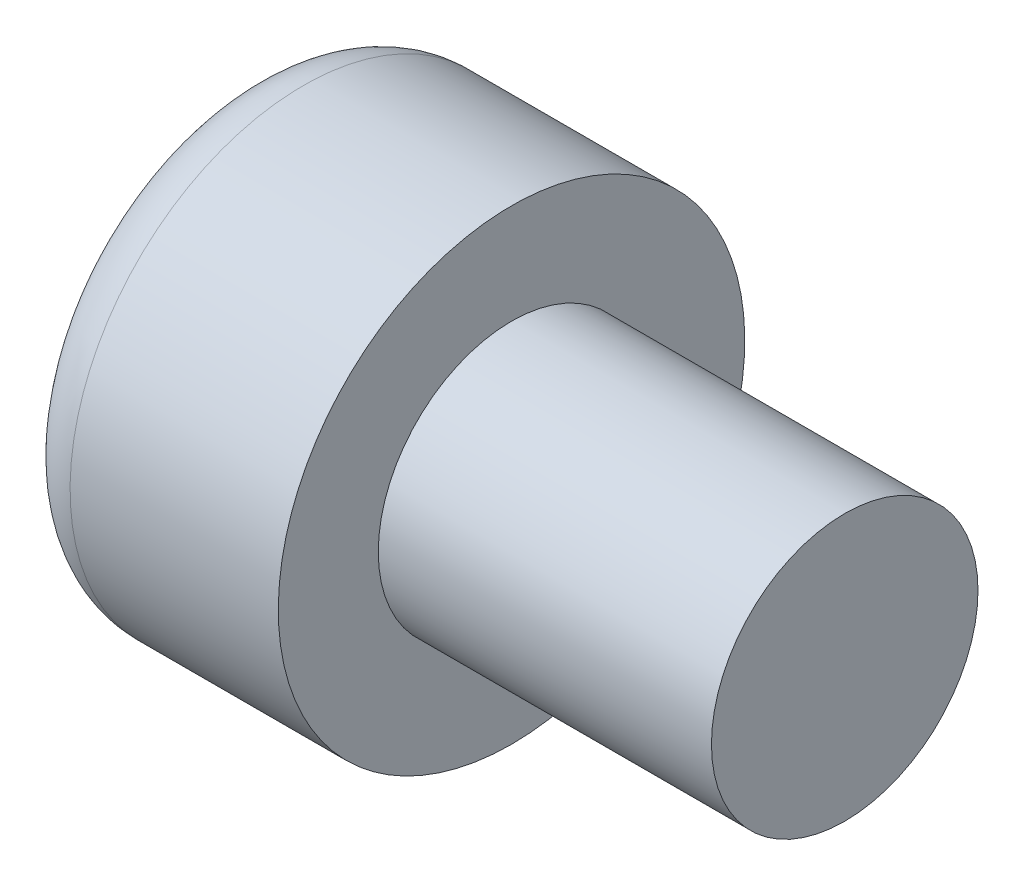
ISO-10303-21;
HEADER;
FILE_DESCRIPTION(('STEP AP214'),'2;1');
FILE_NAME('part.step','',(''),(''),'','','');
FILE_SCHEMA(('AUTOMOTIVE_DESIGN { 1 0 10303 214 1 1 1 1 }'));
ENDSEC;
DATA;
#1=APPLICATION_CONTEXT('core data for automotive mechanical design processes');
#2=APPLICATION_PROTOCOL_DEFINITION('international standard','automotive_design',2000,#1);
#3=PRODUCT_CONTEXT('',#1,'mechanical');
#4=PRODUCT('Part','Part','',(#3));
#5=PRODUCT_RELATED_PRODUCT_CATEGORY('part','',(#4));
#6=PRODUCT_DEFINITION_FORMATION('','',#4);
#7=PRODUCT_DEFINITION_CONTEXT('part definition',#1,'design');
#8=PRODUCT_DEFINITION('design','',#6,#7);
#9=PRODUCT_DEFINITION_SHAPE('','',#8);
#10=(LENGTH_UNIT() NAMED_UNIT(*) SI_UNIT(.MILLI.,.METRE.));
#11=(NAMED_UNIT(*) PLANE_ANGLE_UNIT() SI_UNIT($,.RADIAN.));
#12=(NAMED_UNIT(*) SI_UNIT($,.STERADIAN.) SOLID_ANGLE_UNIT());
#13=UNCERTAINTY_MEASURE_WITH_UNIT(LENGTH_MEASURE(1.E-05),#10,'distance_accuracy_value','');
#14=(GEOMETRIC_REPRESENTATION_CONTEXT(3) GLOBAL_UNCERTAINTY_ASSIGNED_CONTEXT((#13)) GLOBAL_UNIT_ASSIGNED_CONTEXT((#10,
#11,#12)) REPRESENTATION_CONTEXT('',''));
#15=CARTESIAN_POINT('',(0.,0.,0.));
#16=DIRECTION('',(0.,0.,1.));
#17=DIRECTION('',(1.,0.,0.));
#18=AXIS2_PLACEMENT_3D('',#15,#16,#17);
#19=CARTESIAN_POINT('',(0.,0.,0.));
#20=DIRECTION('',(1.,0.,0.));
#21=DIRECTION('',(0.,1.,0.));
#22=AXIS2_PLACEMENT_3D('',#19,#20,#21);
#23=PLANE('',#22);
#24=DIRECTION('',(0.,-0.5,-0.866025403784439));
#25=VECTOR('',#24,1.);
#26=CARTESIAN_POINT('',(0.,1.73205080756888,0.));
#27=LINE('',#26,#25);
#28=CARTESIAN_POINT('',(0.,1.73205080756888,0.));
#29=VERTEX_POINT('',#28);
#30=CARTESIAN_POINT('',(0.,0.866025403784439,-1.5));
#31=VERTEX_POINT('',#30);
#32=EDGE_CURVE('E120',#29,#31,#27,.T.);
#33=ORIENTED_EDGE('',*,*,#32,.F.);
#34=DIRECTION('',(0.,0.5,-0.866025403784439));
#35=VECTOR('',#34,1.);
#36=CARTESIAN_POINT('',(0.,0.866025403784439,1.5));
#37=LINE('',#36,#35);
#38=CARTESIAN_POINT('',(0.,0.866025403784439,1.5));
#39=VERTEX_POINT('',#38);
#40=EDGE_CURVE('E46',#39,#29,#37,.T.);
#41=ORIENTED_EDGE('',*,*,#40,.F.);
#42=DIRECTION('',(0.,1.,0.));
#43=VECTOR('',#42,1.);
#44=CARTESIAN_POINT('',(0.,-0.866025403784439,1.5));
#45=LINE('',#44,#43);
#46=CARTESIAN_POINT('',(0.,-0.866025403784439,1.5));
#47=VERTEX_POINT('',#46);
#48=EDGE_CURVE('E129',#47,#39,#45,.T.);
#49=ORIENTED_EDGE('',*,*,#48,.F.);
#50=DIRECTION('',(0.,0.5,0.866025403784439));
#51=VECTOR('',#50,1.);
#52=CARTESIAN_POINT('',(0.,-1.73205080756888,0.));
#53=LINE('',#52,#51);
#54=CARTESIAN_POINT('',(0.,-1.73205080756888,0.));
#55=VERTEX_POINT('',#54);
#56=EDGE_CURVE('E127',#55,#47,#53,.T.);
#57=ORIENTED_EDGE('',*,*,#56,.F.);
#58=DIRECTION('',(0.,-0.5,0.866025403784439));
#59=VECTOR('',#58,1.);
#60=CARTESIAN_POINT('',(0.,-0.866025403784439,-1.5));
#61=LINE('',#60,#59);
#62=CARTESIAN_POINT('',(0.,-0.866025403784439,-1.5));
#63=VERTEX_POINT('',#62);
#64=EDGE_CURVE('E94',#63,#55,#61,.T.);
#65=ORIENTED_EDGE('',*,*,#64,.F.);
#66=DIRECTION('',(0.,-1.,0.));
#67=VECTOR('',#66,1.);
#68=CARTESIAN_POINT('',(0.,0.866025403784439,-1.5));
#69=LINE('',#68,#67);
#70=EDGE_CURVE('E123',#31,#63,#69,.T.);
#71=ORIENTED_EDGE('',*,*,#70,.F.);
#72=EDGE_LOOP('',(#33,#41,#49,#57,#65,#71));
#73=FACE_BOUND('',#72,.T.);
#74=CARTESIAN_POINT('',(0.,0.,0.));
#75=DIRECTION('',(-1.,0.,0.));
#76=DIRECTION('',(0.,-1.,0.));
#77=AXIS2_PLACEMENT_3D('',#74,#75,#76);
#78=CIRCLE('',#77,2.625);
#79=CARTESIAN_POINT('',(0.,-2.625,0.));
#80=VERTEX_POINT('',#79);
#81=EDGE_CURVE('E11',#80,#80,#78,.T.);
#82=ORIENTED_EDGE('',*,*,#81,.T.);
#83=EDGE_LOOP('',(#82));
#84=FACE_BOUND('',#83,.T.);
#85=ADVANCED_FACE('F32',(#73,#84),#23,.F.);
#86=CARTESIAN_POINT('',(0.874999999999999,0.,0.));
#87=DIRECTION('',(-1.,0.,0.));
#88=DIRECTION('',(0.,-1.,0.));
#89=AXIS2_PLACEMENT_3D('',#86,#87,#88);
#90=TOROIDAL_SURFACE('',#89,2.625,0.875);
#91=ORIENTED_EDGE('',*,*,#81,.F.);
#92=EDGE_LOOP('',(#91));
#93=FACE_BOUND('',#92,.T.);
#94=CARTESIAN_POINT('',(0.874999999999999,0.,0.));
#95=DIRECTION('',(-1.,0.,0.));
#96=DIRECTION('',(0.,-1.,0.));
#97=AXIS2_PLACEMENT_3D('',#94,#95,#96);
#98=CIRCLE('',#97,3.5);
#99=CARTESIAN_POINT('',(0.874999999999998,-3.5,0.));
#100=VERTEX_POINT('',#99);
#101=EDGE_CURVE('E39',#100,#100,#98,.T.);
#102=ORIENTED_EDGE('',*,*,#101,.T.);
#103=EDGE_LOOP('',(#102));
#104=FACE_BOUND('',#103,.T.);
#105=ADVANCED_FACE('F149',(#93,#104),#90,.T.);
#106=CARTESIAN_POINT('',(0.,0.,0.));
#107=DIRECTION('',(-1.,0.,0.));
#108=DIRECTION('',(0.,-1.,0.));
#109=AXIS2_PLACEMENT_3D('',#106,#107,#108);
#110=CYLINDRICAL_SURFACE('',#109,3.5);
#111=ORIENTED_EDGE('',*,*,#101,.F.);
#112=EDGE_LOOP('',(#111));
#113=FACE_BOUND('',#112,.T.);
#114=CARTESIAN_POINT('',(4.,0.,0.));
#115=DIRECTION('',(-1.,0.,0.));
#116=DIRECTION('',(0.,-1.,0.));
#117=AXIS2_PLACEMENT_3D('',#114,#115,#116);
#118=CIRCLE('',#117,3.5);
#119=CARTESIAN_POINT('',(4.,-3.5,0.));
#120=VERTEX_POINT('',#119);
#121=EDGE_CURVE('E144',#120,#120,#118,.T.);
#122=ORIENTED_EDGE('',*,*,#121,.T.);
#123=EDGE_LOOP('',(#122));
#124=FACE_BOUND('',#123,.T.);
#125=ADVANCED_FACE('F151',(#113,#124),#110,.T.);
#126=CARTESIAN_POINT('',(4.,3.5,0.));
#127=DIRECTION('',(-1.,0.,0.));
#128=DIRECTION('',(0.,-1.,0.));
#129=AXIS2_PLACEMENT_3D('',#126,#127,#128);
#130=PLANE('',#129);
#131=ORIENTED_EDGE('',*,*,#121,.F.);
#132=EDGE_LOOP('',(#131));
#133=FACE_BOUND('',#132,.T.);
#134=CARTESIAN_POINT('',(4.,0.,0.));
#135=DIRECTION('',(-1.,0.,0.));
#136=DIRECTION('',(0.,-1.,0.));
#137=AXIS2_PLACEMENT_3D('',#134,#135,#136);
#138=CIRCLE('',#137,2.);
#139=CARTESIAN_POINT('',(4.,-2.,0.));
#140=VERTEX_POINT('',#139);
#141=EDGE_CURVE('E141',#140,#140,#138,.T.);
#142=ORIENTED_EDGE('',*,*,#141,.T.);
#143=EDGE_LOOP('',(#142));
#144=FACE_BOUND('',#143,.T.);
#145=ADVANCED_FACE('F154',(#133,#144),#130,.F.);
#146=CARTESIAN_POINT('',(0.,0.,0.));
#147=DIRECTION('',(-1.,0.,0.));
#148=DIRECTION('',(0.,-1.,0.));
#149=AXIS2_PLACEMENT_3D('',#146,#147,#148);
#150=CYLINDRICAL_SURFACE('',#149,2.);
#151=ORIENTED_EDGE('',*,*,#141,.F.);
#152=EDGE_LOOP('',(#151));
#153=FACE_BOUND('',#152,.T.);
#154=CARTESIAN_POINT('',(9.,0.,0.));
#155=DIRECTION('',(-1.,0.,0.));
#156=DIRECTION('',(0.,-1.,0.));
#157=AXIS2_PLACEMENT_3D('',#154,#155,#156);
#158=CIRCLE('',#157,2.);
#159=CARTESIAN_POINT('',(9.,-2.,0.));
#160=VERTEX_POINT('',#159);
#161=EDGE_CURVE('E133',#160,#160,#158,.T.);
#162=ORIENTED_EDGE('',*,*,#161,.T.);
#163=EDGE_LOOP('',(#162));
#164=FACE_BOUND('',#163,.T.);
#165=ADVANCED_FACE('F160',(#153,#164),#150,.T.);
#166=CARTESIAN_POINT('',(9.,2.,0.));
#167=DIRECTION('',(-1.,0.,0.));
#168=DIRECTION('',(0.,-1.,0.));
#169=AXIS2_PLACEMENT_3D('',#166,#167,#168);
#170=PLANE('',#169);
#171=ORIENTED_EDGE('',*,*,#161,.F.);
#172=EDGE_LOOP('',(#171));
#173=FACE_BOUND('',#172,.T.);
#174=ADVANCED_FACE('F166',(#173),#170,.F.);
#175=CARTESIAN_POINT('',(2.,0.866025403784439,1.5));
#176=DIRECTION('',(0.,0.866025403784439,0.5));
#177=DIRECTION('',(0.,-0.5,0.866025403784439));
#178=AXIS2_PLACEMENT_3D('',#175,#176,#177);
#179=PLANE('',#178);
#180=ORIENTED_EDGE('',*,*,#40,.T.);
#181=DIRECTION('',(-1.,0.,0.));
#182=VECTOR('',#181,1.);
#183=CARTESIAN_POINT('',(2.,1.73205080756888,0.));
#184=LINE('',#183,#182);
#185=CARTESIAN_POINT('',(2.,1.73205080756888,0.));
#186=VERTEX_POINT('',#185);
#187=EDGE_CURVE('E76',#186,#29,#184,.T.);
#188=ORIENTED_EDGE('',*,*,#187,.F.);
#189=DIRECTION('',(0.,0.5,-0.866025403784439));
#190=VECTOR('',#189,1.);
#191=CARTESIAN_POINT('',(2.,0.866025403784439,1.5));
#192=LINE('',#191,#190);
#193=CARTESIAN_POINT('',(2.,0.866025403784439,1.5));
#194=VERTEX_POINT('',#193);
#195=EDGE_CURVE('E131',#194,#186,#192,.T.);
#196=ORIENTED_EDGE('',*,*,#195,.F.);
#197=DIRECTION('',(-1.,0.,0.));
#198=VECTOR('',#197,1.);
#199=CARTESIAN_POINT('',(2.,0.866025403784439,1.5));
#200=LINE('',#199,#198);
#201=EDGE_CURVE('E54',#194,#39,#200,.T.);
#202=ORIENTED_EDGE('',*,*,#201,.T.);
#203=EDGE_LOOP('',(#180,#188,#196,#202));
#204=FACE_BOUND('',#203,.T.);
#205=ADVANCED_FACE('F171',(#204),#179,.F.);
#206=CARTESIAN_POINT('',(2.,-0.866025403784439,1.5));
#207=DIRECTION('',(0.,0.,1.));
#208=DIRECTION('',(0.,-1.,0.));
#209=AXIS2_PLACEMENT_3D('',#206,#207,#208);
#210=PLANE('',#209);
#211=ORIENTED_EDGE('',*,*,#48,.T.);
#212=ORIENTED_EDGE('',*,*,#201,.F.);
#213=DIRECTION('',(0.,1.,0.));
#214=VECTOR('',#213,1.);
#215=CARTESIAN_POINT('',(2.,-0.866025403784439,1.5));
#216=LINE('',#215,#214);
#217=CARTESIAN_POINT('',(2.,-0.866025403784439,1.5));
#218=VERTEX_POINT('',#217);
#219=EDGE_CURVE('E106',#218,#194,#216,.T.);
#220=ORIENTED_EDGE('',*,*,#219,.F.);
#221=DIRECTION('',(-1.,0.,0.));
#222=VECTOR('',#221,1.);
#223=CARTESIAN_POINT('',(2.,-0.866025403784439,1.5));
#224=LINE('',#223,#222);
#225=EDGE_CURVE('E98',#218,#47,#224,.T.);
#226=ORIENTED_EDGE('',*,*,#225,.T.);
#227=EDGE_LOOP('',(#211,#212,#220,#226));
#228=FACE_BOUND('',#227,.T.);
#229=ADVANCED_FACE('F176',(#228),#210,.F.);
#230=CARTESIAN_POINT('',(2.,-1.73205080756888,0.));
#231=DIRECTION('',(0.,-0.866025403784439,0.5));
#232=DIRECTION('',(0.,-0.5,-0.866025403784439));
#233=AXIS2_PLACEMENT_3D('',#230,#231,#232);
#234=PLANE('',#233);
#235=ORIENTED_EDGE('',*,*,#56,.T.);
#236=ORIENTED_EDGE('',*,*,#225,.F.);
#237=DIRECTION('',(0.,0.5,0.866025403784439));
#238=VECTOR('',#237,1.);
#239=CARTESIAN_POINT('',(2.,-1.73205080756888,0.));
#240=LINE('',#239,#238);
#241=CARTESIAN_POINT('',(2.,-1.73205080756888,0.));
#242=VERTEX_POINT('',#241);
#243=EDGE_CURVE('E102',#242,#218,#240,.T.);
#244=ORIENTED_EDGE('',*,*,#243,.F.);
#245=DIRECTION('',(-1.,0.,0.));
#246=VECTOR('',#245,1.);
#247=CARTESIAN_POINT('',(2.,-1.73205080756888,0.));
#248=LINE('',#247,#246);
#249=EDGE_CURVE('E87',#242,#55,#248,.T.);
#250=ORIENTED_EDGE('',*,*,#249,.T.);
#251=EDGE_LOOP('',(#235,#236,#244,#250));
#252=FACE_BOUND('',#251,.T.);
#253=ADVANCED_FACE('F103',(#252),#234,.F.);
#254=CARTESIAN_POINT('',(2.,-0.866025403784439,-1.5));
#255=DIRECTION('',(0.,-0.866025403784439,-0.5));
#256=DIRECTION('',(0.,0.5,-0.866025403784439));
#257=AXIS2_PLACEMENT_3D('',#254,#255,#256);
#258=PLANE('',#257);
#259=ORIENTED_EDGE('',*,*,#64,.T.);
#260=ORIENTED_EDGE('',*,*,#249,.F.);
#261=DIRECTION('',(0.,-0.5,0.866025403784439));
#262=VECTOR('',#261,1.);
#263=CARTESIAN_POINT('',(2.,-0.866025403784439,-1.5));
#264=LINE('',#263,#262);
#265=CARTESIAN_POINT('',(2.,-0.866025403784439,-1.5));
#266=VERTEX_POINT('',#265);
#267=EDGE_CURVE('E91',#266,#242,#264,.T.);
#268=ORIENTED_EDGE('',*,*,#267,.F.);
#269=DIRECTION('',(-1.,0.,0.));
#270=VECTOR('',#269,1.);
#271=CARTESIAN_POINT('',(2.,-0.866025403784439,-1.5));
#272=LINE('',#271,#270);
#273=EDGE_CURVE('E99',#266,#63,#272,.T.);
#274=ORIENTED_EDGE('',*,*,#273,.T.);
#275=EDGE_LOOP('',(#259,#260,#268,#274));
#276=FACE_BOUND('',#275,.T.);
#277=ADVANCED_FACE('F89',(#276),#258,.F.);
#278=CARTESIAN_POINT('',(2.,0.866025403784439,-1.5));
#279=DIRECTION('',(0.,0.,-1.));
#280=DIRECTION('',(-1.,0.,0.));
#281=AXIS2_PLACEMENT_3D('',#278,#279,#280);
#282=PLANE('',#281);
#283=ORIENTED_EDGE('',*,*,#70,.T.);
#284=ORIENTED_EDGE('',*,*,#273,.F.);
#285=DIRECTION('',(0.,-1.,0.));
#286=VECTOR('',#285,1.);
#287=CARTESIAN_POINT('',(2.,0.866025403784439,-1.5));
#288=LINE('',#287,#286);
#289=CARTESIAN_POINT('',(2.,0.866025403784439,-1.5));
#290=VERTEX_POINT('',#289);
#291=EDGE_CURVE('E112',#290,#266,#288,.T.);
#292=ORIENTED_EDGE('',*,*,#291,.F.);
#293=DIRECTION('',(-1.,0.,0.));
#294=VECTOR('',#293,1.);
#295=CARTESIAN_POINT('',(2.,0.866025403784439,-1.5));
#296=LINE('',#295,#294);
#297=EDGE_CURVE('E136',#290,#31,#296,.T.);
#298=ORIENTED_EDGE('',*,*,#297,.T.);
#299=EDGE_LOOP('',(#283,#284,#292,#298));
#300=FACE_BOUND('',#299,.T.);
#301=ADVANCED_FACE('F202',(#300),#282,.F.);
#302=CARTESIAN_POINT('',(2.,1.73205080756888,0.));
#303=DIRECTION('',(0.,0.866025403784439,-0.5));
#304=DIRECTION('',(0.,0.5,0.866025403784439));
#305=AXIS2_PLACEMENT_3D('',#302,#303,#304);
#306=PLANE('',#305);
#307=ORIENTED_EDGE('',*,*,#32,.T.);
#308=ORIENTED_EDGE('',*,*,#297,.F.);
#309=DIRECTION('',(0.,-0.5,-0.866025403784439));
#310=VECTOR('',#309,1.);
#311=CARTESIAN_POINT('',(2.,1.73205080756888,0.));
#312=LINE('',#311,#310);
#313=EDGE_CURVE('E114',#186,#290,#312,.T.);
#314=ORIENTED_EDGE('',*,*,#313,.F.);
#315=ORIENTED_EDGE('',*,*,#187,.T.);
#316=EDGE_LOOP('',(#307,#308,#314,#315));
#317=FACE_BOUND('',#316,.T.);
#318=ADVANCED_FACE('F190',(#317),#306,.F.);
#319=CARTESIAN_POINT('',(2.,0.,0.));
#320=DIRECTION('',(-1.,0.,0.));
#321=DIRECTION('',(0.,-1.,0.));
#322=AXIS2_PLACEMENT_3D('',#319,#320,#321);
#323=PLANE('',#322);
#324=ORIENTED_EDGE('',*,*,#195,.T.);
#325=ORIENTED_EDGE('',*,*,#313,.T.);
#326=ORIENTED_EDGE('',*,*,#291,.T.);
#327=ORIENTED_EDGE('',*,*,#267,.T.);
#328=ORIENTED_EDGE('',*,*,#243,.T.);
#329=ORIENTED_EDGE('',*,*,#219,.T.);
#330=EDGE_LOOP('',(#324,#325,#326,#327,#328,#329));
#331=FACE_BOUND('',#330,.T.);
#332=ADVANCED_FACE('F109',(#331),#323,.T.);
#333=CLOSED_SHELL('',(#85,#105,#125,#145,#165,#174,#205,#229,#253,#277,#301,#318,#332));
#334=MANIFOLD_SOLID_BREP('B2',#333);
#335=ADVANCED_BREP_SHAPE_REPRESENTATION('',(#18,#334),#14);
#336=SHAPE_DEFINITION_REPRESENTATION(#9,#335);
ENDSEC;
END-ISO-10303-21;
